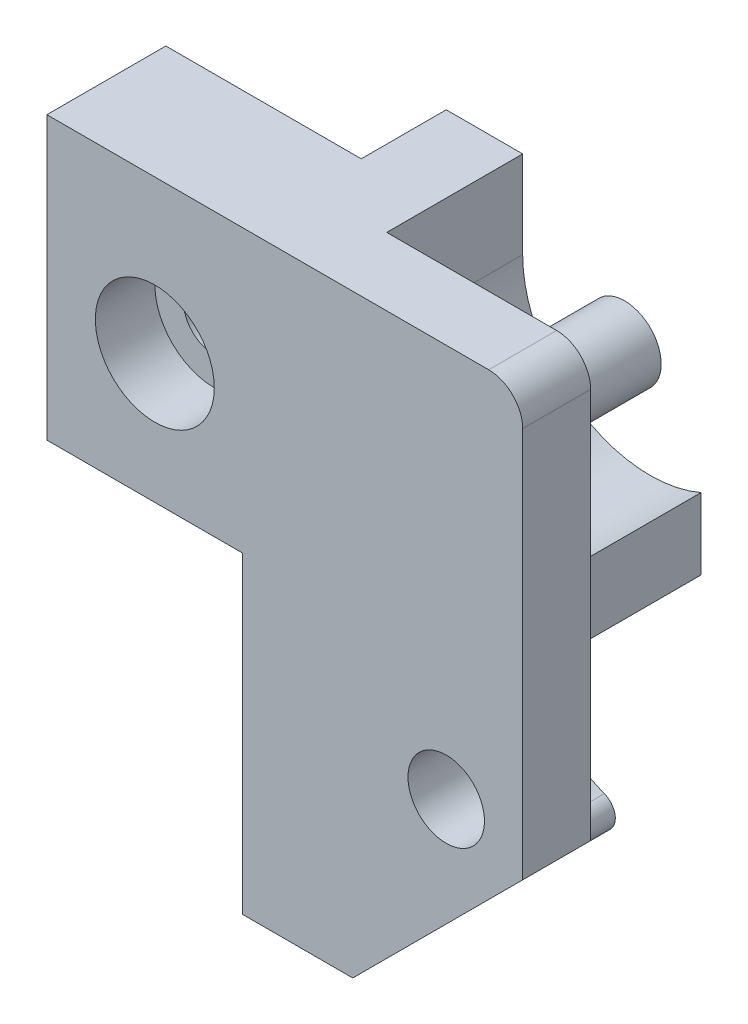
ISO-10303-21;
HEADER;
FILE_DESCRIPTION(('STEP AP214'),'2;1');
FILE_NAME('part.step','',(''),(''),'','','');
FILE_SCHEMA(('AUTOMOTIVE_DESIGN { 1 0 10303 214 1 1 1 1 }'));
ENDSEC;
DATA;
#1=APPLICATION_CONTEXT('core data for automotive mechanical design processes');
#2=APPLICATION_PROTOCOL_DEFINITION('international standard','automotive_design',2000,#1);
#3=PRODUCT_CONTEXT('',#1,'mechanical');
#4=PRODUCT('Part','Part','',(#3));
#5=PRODUCT_RELATED_PRODUCT_CATEGORY('part','',(#4));
#6=PRODUCT_DEFINITION_FORMATION('','',#4);
#7=PRODUCT_DEFINITION_CONTEXT('part definition',#1,'design');
#8=PRODUCT_DEFINITION('design','',#6,#7);
#9=PRODUCT_DEFINITION_SHAPE('','',#8);
#10=(LENGTH_UNIT() NAMED_UNIT(*) SI_UNIT(.MILLI.,.METRE.));
#11=(NAMED_UNIT(*) PLANE_ANGLE_UNIT() SI_UNIT($,.RADIAN.));
#12=(NAMED_UNIT(*) SI_UNIT($,.STERADIAN.) SOLID_ANGLE_UNIT());
#13=UNCERTAINTY_MEASURE_WITH_UNIT(LENGTH_MEASURE(1.E-05),#10,'distance_accuracy_value','');
#14=(GEOMETRIC_REPRESENTATION_CONTEXT(3) GLOBAL_UNCERTAINTY_ASSIGNED_CONTEXT((#13)) GLOBAL_UNIT_ASSIGNED_CONTEXT((#10,
#11,#12)) REPRESENTATION_CONTEXT('',''));
#15=CARTESIAN_POINT('',(0.,0.,0.));
#16=DIRECTION('',(0.,0.,1.));
#17=DIRECTION('',(1.,0.,0.));
#18=AXIS2_PLACEMENT_3D('',#15,#16,#17);
#19=CARTESIAN_POINT('',(23.5,29.8639610306789,-8.));
#20=DIRECTION('',(0.,0.,1.));
#21=DIRECTION('',(1.,0.,0.));
#22=AXIS2_PLACEMENT_3D('',#19,#20,#21);
#23=CYLINDRICAL_SURFACE('',#22,2.15);
#24=CARTESIAN_POINT('',(23.5,29.8639610306789,0.));
#25=DIRECTION('',(0.,0.,1.));
#26=DIRECTION('',(1.,0.,0.));
#27=AXIS2_PLACEMENT_3D('',#24,#25,#26);
#28=CIRCLE('',#27,2.15);
#29=CARTESIAN_POINT('',(25.65,29.8639610306789,0.));
#30=VERTEX_POINT('',#29);
#31=EDGE_CURVE('E45',#30,#30,#28,.F.);
#32=ORIENTED_EDGE('',*,*,#31,.T.);
#33=EDGE_LOOP('',(#32));
#34=FACE_BOUND('',#33,.T.);
#35=CARTESIAN_POINT('',(23.5,29.8639610306789,-6.5));
#36=DIRECTION('',(0.,0.,-1.));
#37=DIRECTION('',(-1.,0.,0.));
#38=AXIS2_PLACEMENT_3D('',#35,#36,#37);
#39=CIRCLE('',#38,2.15);
#40=CARTESIAN_POINT('',(21.35,29.8639610306789,-6.5));
#41=VERTEX_POINT('',#40);
#42=EDGE_CURVE('E391',#41,#41,#39,.T.);
#43=ORIENTED_EDGE('',*,*,#42,.F.);
#44=EDGE_LOOP('',(#43));
#45=FACE_BOUND('',#44,.T.);
#46=ADVANCED_FACE('F37',(#34,#45),#23,.T.);
#47=CARTESIAN_POINT('',(23.5,29.8639610306789,-8.));
#48=DIRECTION('',(0.,0.,-1.));
#49=DIRECTION('',(-1.,0.,0.));
#50=AXIS2_PLACEMENT_3D('',#47,#48,#49);
#51=PLANE('',#50);
#52=DIRECTION('',(1.,0.,0.));
#53=VECTOR('',#52,1.);
#54=CARTESIAN_POINT('',(0.,18.4139610306789,-8.));
#55=LINE('',#54,#53);
#56=CARTESIAN_POINT('',(11.5,18.4139610306789,-8.));
#57=VERTEX_POINT('',#56);
#58=CARTESIAN_POINT('',(19.7450033288963,18.4139610306789,-8.));
#59=VERTEX_POINT('',#58);
#60=EDGE_CURVE('E214',#57,#59,#55,.T.);
#61=ORIENTED_EDGE('',*,*,#60,.F.);
#62=DIRECTION('',(0.,1.,0.));
#63=VECTOR('',#62,1.);
#64=CARTESIAN_POINT('',(11.5,0.,-8.));
#65=LINE('',#64,#63);
#66=CARTESIAN_POINT('',(11.5,35.,-8.));
#67=VERTEX_POINT('',#66);
#68=EDGE_CURVE('E388',#57,#67,#65,.T.);
#69=ORIENTED_EDGE('',*,*,#68,.T.);
#70=DIRECTION('',(1.,0.,0.));
#71=VECTOR('',#70,1.);
#72=CARTESIAN_POINT('',(0.,35.,-8.));
#73=LINE('',#72,#71);
#74=CARTESIAN_POINT('',(16.,35.,-8.));
#75=VERTEX_POINT('',#74);
#76=EDGE_CURVE('E228',#67,#75,#73,.T.);
#77=ORIENTED_EDGE('',*,*,#76,.T.);
#78=DIRECTION('',(0.,1.,0.));
#79=VECTOR('',#78,1.);
#80=CARTESIAN_POINT('',(16.,0.,-8.));
#81=LINE('',#80,#79);
#82=CARTESIAN_POINT('',(16.,29.8639610306789,-8.));
#83=VERTEX_POINT('',#82);
#84=EDGE_CURVE('E220',#83,#75,#81,.T.);
#85=ORIENTED_EDGE('',*,*,#84,.F.);
#86=CARTESIAN_POINT('',(23.5,29.8639610306789,-8.));
#87=DIRECTION('',(0.,0.,-1.));
#88=DIRECTION('',(-1.,0.,0.));
#89=AXIS2_PLACEMENT_3D('',#86,#87,#88);
#90=CIRCLE('',#89,7.5);
#91=CARTESIAN_POINT('',(26.5,22.9900974882452,-8.));
#92=VERTEX_POINT('',#91);
#93=EDGE_CURVE('E224',#92,#83,#90,.T.);
#94=ORIENTED_EDGE('',*,*,#93,.F.);
#95=DIRECTION('',(0.,-1.,0.));
#96=VECTOR('',#95,1.);
#97=CARTESIAN_POINT('',(26.5,0.,-8.));
#98=LINE('',#97,#96);
#99=CARTESIAN_POINT('',(26.5,18.7923446805644,-8.));
#100=VERTEX_POINT('',#99);
#101=EDGE_CURVE('E235',#92,#100,#98,.T.);
#102=ORIENTED_EDGE('',*,*,#101,.T.);
#103=CARTESIAN_POINT('',(23.5,11.8639610306789,-8.));
#104=DIRECTION('',(0.,0.,-1.));
#105=DIRECTION('',(-1.,0.,0.));
#106=AXIS2_PLACEMENT_3D('',#103,#104,#105);
#107=CIRCLE('',#106,7.55);
#108=EDGE_CURVE('E238',#59,#100,#107,.T.);
#109=ORIENTED_EDGE('',*,*,#108,.F.);
#110=EDGE_LOOP('',(#61,#69,#77,#85,#94,#102,#109));
#111=FACE_BOUND('',#110,.T.);
#112=ADVANCED_FACE('F327',(#111),#51,.T.);
#113=CARTESIAN_POINT('',(0.,0.,4.));
#114=DIRECTION('',(1.,0.,0.));
#115=DIRECTION('',(0.,0.,-1.));
#116=AXIS2_PLACEMENT_3D('',#113,#114,#115);
#117=PLANE('',#116);
#118=DIRECTION('',(0.,1.,0.));
#119=VECTOR('',#118,1.);
#120=CARTESIAN_POINT('',(0.,0.,-3.));
#121=LINE('',#120,#119);
#122=CARTESIAN_POINT('',(0.,18.4139610306789,-3.));
#123=VERTEX_POINT('',#122);
#124=CARTESIAN_POINT('',(0.,35.,-3.));
#125=VERTEX_POINT('',#124);
#126=EDGE_CURVE('E172',#123,#125,#121,.T.);
#127=ORIENTED_EDGE('',*,*,#126,.F.);
#128=DIRECTION('',(0.,0.,-1.));
#129=VECTOR('',#128,1.);
#130=CARTESIAN_POINT('',(0.,18.4139610306789,4.));
#131=LINE('',#130,#129);
#132=CARTESIAN_POINT('',(0.,18.4139610306789,4.));
#133=VERTEX_POINT('',#132);
#134=EDGE_CURVE('E182',#133,#123,#131,.T.);
#135=ORIENTED_EDGE('',*,*,#134,.F.);
#136=DIRECTION('',(0.,-1.,0.));
#137=VECTOR('',#136,1.);
#138=CARTESIAN_POINT('',(0.,0.,4.));
#139=LINE('',#138,#137);
#140=CARTESIAN_POINT('',(0.,35.,4.));
#141=VERTEX_POINT('',#140);
#142=EDGE_CURVE('E274',#141,#133,#139,.T.);
#143=ORIENTED_EDGE('',*,*,#142,.F.);
#144=DIRECTION('',(0.,0.,-1.));
#145=VECTOR('',#144,1.);
#146=CARTESIAN_POINT('',(0.,35.,4.));
#147=LINE('',#146,#145);
#148=EDGE_CURVE('E185',#141,#125,#147,.T.);
#149=ORIENTED_EDGE('',*,*,#148,.T.);
#150=EDGE_LOOP('',(#127,#135,#143,#149));
#151=FACE_BOUND('',#150,.T.);
#152=ADVANCED_FACE('F39',(#151),#117,.F.);
#153=CARTESIAN_POINT('',(0.,35.,4.));
#154=DIRECTION('',(0.,-1.,0.));
#155=DIRECTION('',(0.,0.,-1.));
#156=AXIS2_PLACEMENT_3D('',#153,#154,#155);
#157=PLANE('',#156);
#158=DIRECTION('',(0.,0.,-1.));
#159=VECTOR('',#158,1.);
#160=CARTESIAN_POINT('',(11.5,35.,-3.));
#161=LINE('',#160,#159);
#162=CARTESIAN_POINT('',(11.5,35.,-3.));
#163=VERTEX_POINT('',#162);
#164=EDGE_CURVE('E381',#163,#67,#161,.T.);
#165=ORIENTED_EDGE('',*,*,#164,.F.);
#166=DIRECTION('',(1.,0.,0.));
#167=VECTOR('',#166,1.);
#168=CARTESIAN_POINT('',(0.,35.,-3.));
#169=LINE('',#168,#167);
#170=EDGE_CURVE('E186',#125,#163,#169,.T.);
#171=ORIENTED_EDGE('',*,*,#170,.F.);
#172=ORIENTED_EDGE('',*,*,#148,.F.);
#173=DIRECTION('',(-1.,0.,0.));
#174=VECTOR('',#173,1.);
#175=CARTESIAN_POINT('',(0.,35.,4.));
#176=LINE('',#175,#174);
#177=CARTESIAN_POINT('',(26.,35.,4.));
#178=VERTEX_POINT('',#177);
#179=EDGE_CURVE('E285',#178,#141,#176,.T.);
#180=ORIENTED_EDGE('',*,*,#179,.F.);
#181=DIRECTION('',(0.,0.,-1.));
#182=VECTOR('',#181,1.);
#183=CARTESIAN_POINT('',(26.,35.,4.));
#184=LINE('',#183,#182);
#185=CARTESIAN_POINT('',(26.,35.,0.));
#186=VERTEX_POINT('',#185);
#187=EDGE_CURVE('E295',#178,#186,#184,.T.);
#188=ORIENTED_EDGE('',*,*,#187,.T.);
#189=DIRECTION('',(-1.,0.,0.));
#190=VECTOR('',#189,1.);
#191=CARTESIAN_POINT('',(0.,35.,0.));
#192=LINE('',#191,#190);
#193=CARTESIAN_POINT('',(16.,35.,0.));
#194=VERTEX_POINT('',#193);
#195=EDGE_CURVE('E277',#186,#194,#192,.T.);
#196=ORIENTED_EDGE('',*,*,#195,.T.);
#197=DIRECTION('',(0.,0.,1.));
#198=VECTOR('',#197,1.);
#199=CARTESIAN_POINT('',(16.,35.,-51.9004555785017));
#200=LINE('',#199,#198);
#201=EDGE_CURVE('E231',#75,#194,#200,.T.);
#202=ORIENTED_EDGE('',*,*,#201,.F.);
#203=ORIENTED_EDGE('',*,*,#76,.F.);
#204=EDGE_LOOP('',(#165,#171,#172,#180,#188,#196,#202,#203));
#205=FACE_BOUND('',#204,.T.);
#206=ADVANCED_FACE('F379',(#205),#157,.F.);
#207=CARTESIAN_POINT('',(0.,18.4139610306789,-51.9004555785017));
#208=DIRECTION('',(0.,-1.,0.));
#209=DIRECTION('',(1.,0.,0.));
#210=AXIS2_PLACEMENT_3D('',#207,#208,#209);
#211=PLANE('',#210);
#212=DIRECTION('',(-1.,0.,0.));
#213=VECTOR('',#212,1.);
#214=CARTESIAN_POINT('',(0.,18.4139610306789,-3.));
#215=LINE('',#214,#213);
#216=CARTESIAN_POINT('',(11.5,18.4139610306789,-3.));
#217=VERTEX_POINT('',#216);
#218=EDGE_CURVE('E168',#217,#123,#215,.T.);
#219=ORIENTED_EDGE('',*,*,#218,.F.);
#220=DIRECTION('',(0.,0.,-1.));
#221=VECTOR('',#220,1.);
#222=CARTESIAN_POINT('',(11.5,18.4139610306789,-3.));
#223=LINE('',#222,#221);
#224=EDGE_CURVE('E385',#217,#57,#223,.T.);
#225=ORIENTED_EDGE('',*,*,#224,.T.);
#226=ORIENTED_EDGE('',*,*,#60,.T.);
#227=DIRECTION('',(0.,0.,1.));
#228=VECTOR('',#227,1.);
#229=CARTESIAN_POINT('',(19.7450033288963,18.4139610306789,-51.9004555785017));
#230=LINE('',#229,#228);
#231=CARTESIAN_POINT('',(19.7450033288963,18.4139610306789,0.));
#232=VERTEX_POINT('',#231);
#233=EDGE_CURVE('E242',#59,#232,#230,.T.);
#234=ORIENTED_EDGE('',*,*,#233,.T.);
#235=DIRECTION('',(1.,0.,0.));
#236=VECTOR('',#235,1.);
#237=CARTESIAN_POINT('',(0.,18.4139610306789,0.));
#238=LINE('',#237,#236);
#239=CARTESIAN_POINT('',(11.5,18.4139610306789,0.));
#240=VERTEX_POINT('',#239);
#241=EDGE_CURVE('E208',#240,#232,#238,.T.);
#242=ORIENTED_EDGE('',*,*,#241,.F.);
#243=DIRECTION('',(0.,0.,-1.));
#244=VECTOR('',#243,1.);
#245=CARTESIAN_POINT('',(11.5,18.4139610306789,4.));
#246=LINE('',#245,#244);
#247=CARTESIAN_POINT('',(11.5,18.4139610306789,4.));
#248=VERTEX_POINT('',#247);
#249=EDGE_CURVE('E191',#248,#240,#246,.T.);
#250=ORIENTED_EDGE('',*,*,#249,.F.);
#251=DIRECTION('',(1.,0.,0.));
#252=VECTOR('',#251,1.);
#253=CARTESIAN_POINT('',(0.,18.4139610306789,4.));
#254=LINE('',#253,#252);
#255=EDGE_CURVE('E190',#133,#248,#254,.T.);
#256=ORIENTED_EDGE('',*,*,#255,.F.);
#257=ORIENTED_EDGE('',*,*,#134,.T.);
#258=EDGE_LOOP('',(#219,#225,#226,#234,#242,#250,#256,#257));
#259=FACE_BOUND('',#258,.T.);
#260=ADVANCED_FACE('F188',(#259),#211,.T.);
#261=CARTESIAN_POINT('',(6.35,26.,4.));
#262=DIRECTION('',(0.,0.,1.));
#263=DIRECTION('',(1.,0.,0.));
#264=AXIS2_PLACEMENT_3D('',#261,#262,#263);
#265=CYLINDRICAL_SURFACE('',#264,1.8288);
#266=CARTESIAN_POINT('',(6.35,26.,0.4948));
#267=DIRECTION('',(0.,0.,1.));
#268=DIRECTION('',(1.,0.,0.));
#269=AXIS2_PLACEMENT_3D('',#266,#267,#268);
#270=CIRCLE('',#269,1.8288);
#271=CARTESIAN_POINT('',(8.1788,26.,0.4948));
#272=VERTEX_POINT('',#271);
#273=EDGE_CURVE('E398',#272,#272,#270,.T.);
#274=ORIENTED_EDGE('',*,*,#273,.T.);
#275=EDGE_LOOP('',(#274));
#276=FACE_BOUND('',#275,.T.);
#277=CARTESIAN_POINT('',(6.35,26.,-3.));
#278=DIRECTION('',(0.,0.,-1.));
#279=DIRECTION('',(-1.,0.,0.));
#280=AXIS2_PLACEMENT_3D('',#277,#278,#279);
#281=CIRCLE('',#280,1.8288);
#282=CARTESIAN_POINT('',(4.5212,26.,-3.));
#283=VERTEX_POINT('',#282);
#284=EDGE_CURVE('E382',#283,#283,#281,.F.);
#285=ORIENTED_EDGE('',*,*,#284,.F.);
#286=EDGE_LOOP('',(#285));
#287=FACE_BOUND('',#286,.T.);
#288=ADVANCED_FACE('F313',(#276,#287),#265,.F.);
#289=CARTESIAN_POINT('',(26.,33.,0.));
#290=DIRECTION('',(0.,0.,1.));
#291=DIRECTION('',(1.,0.,0.));
#292=AXIS2_PLACEMENT_3D('',#289,#290,#291);
#293=PLANE('',#292);
#294=CARTESIAN_POINT('',(23.5,29.8639610306789,0.));
#295=DIRECTION('',(0.,0.,-1.));
#296=DIRECTION('',(-1.,0.,0.));
#297=AXIS2_PLACEMENT_3D('',#294,#295,#296);
#298=CIRCLE('',#297,7.5);
#299=CARTESIAN_POINT('',(26.5,22.9900974882452,0.));
#300=VERTEX_POINT('',#299);
#301=CARTESIAN_POINT('',(16.,29.8639610306789,0.));
#302=VERTEX_POINT('',#301);
#303=EDGE_CURVE('E205',#300,#302,#298,.T.);
#304=ORIENTED_EDGE('',*,*,#303,.T.);
#305=DIRECTION('',(0.,1.,0.));
#306=VECTOR('',#305,1.);
#307=CARTESIAN_POINT('',(16.,0.,0.));
#308=LINE('',#307,#306);
#309=EDGE_CURVE('E201',#302,#194,#308,.T.);
#310=ORIENTED_EDGE('',*,*,#309,.T.);
#311=ORIENTED_EDGE('',*,*,#195,.F.);
#312=CARTESIAN_POINT('',(26.,33.,0.));
#313=DIRECTION('',(0.,0.,1.));
#314=DIRECTION('',(1.,0.,0.));
#315=AXIS2_PLACEMENT_3D('',#312,#313,#314);
#316=CIRCLE('',#315,2.);
#317=CARTESIAN_POINT('',(28.,33.,0.));
#318=VERTEX_POINT('',#317);
#319=EDGE_CURVE('E290',#318,#186,#316,.T.);
#320=ORIENTED_EDGE('',*,*,#319,.F.);
#321=DIRECTION('',(0.,1.,0.));
#322=VECTOR('',#321,1.);
#323=CARTESIAN_POINT('',(28.,10.,0.));
#324=LINE('',#323,#322);
#325=CARTESIAN_POINT('',(28.,10.,0.));
#326=VERTEX_POINT('',#325);
#327=EDGE_CURVE('E288',#326,#318,#324,.T.);
#328=ORIENTED_EDGE('',*,*,#327,.F.);
#329=DIRECTION('',(0.707106781186547,0.707106781186548,0.));
#330=VECTOR('',#329,1.);
#331=CARTESIAN_POINT('',(18.,0.,0.));
#332=LINE('',#331,#330);
#333=CARTESIAN_POINT('',(21.1582561300546,3.15825613005459,0.));
#334=VERTEX_POINT('',#333);
#335=EDGE_CURVE('E271',#334,#326,#332,.T.);
#336=ORIENTED_EDGE('',*,*,#335,.F.);
#337=CARTESIAN_POINT('',(20.451149348868,3.86536291124113,0.));
#338=DIRECTION('',(0.,0.,-1.));
#339=DIRECTION('',(-1.,0.,0.));
#340=AXIS2_PLACEMENT_3D('',#337,#338,#339);
#341=CIRCLE('',#340,0.999999999999998);
#342=CARTESIAN_POINT('',(20.807324797528,4.79978200874067,0.));
#343=VERTEX_POINT('',#342);
#344=EDGE_CURVE('E204',#334,#343,#341,.F.);
#345=ORIENTED_EDGE('',*,*,#344,.T.);
#346=CARTESIAN_POINT('',(23.5,11.8639610306789,0.));
#347=DIRECTION('',(0.,0.,-1.));
#348=DIRECTION('',(-1.,0.,0.));
#349=AXIS2_PLACEMENT_3D('',#346,#347,#348);
#350=CIRCLE('',#349,7.55996858459081);
#351=CARTESIAN_POINT('',(19.725,5.31396103067893,0.));
#352=VERTEX_POINT('',#351);
#353=EDGE_CURVE('E209',#352,#343,#350,.F.);
#354=ORIENTED_EDGE('',*,*,#353,.F.);
#355=DIRECTION('',(1.,0.,0.));
#356=VECTOR('',#355,1.);
#357=CARTESIAN_POINT('',(0.,5.31396103067893,0.));
#358=LINE('',#357,#356);
#359=CARTESIAN_POINT('',(11.5,5.31396103067893,0.));
#360=VERTEX_POINT('',#359);
#361=EDGE_CURVE('E60',#360,#352,#358,.T.);
#362=ORIENTED_EDGE('',*,*,#361,.F.);
#363=DIRECTION('',(0.,-1.,0.));
#364=VECTOR('',#363,1.);
#365=CARTESIAN_POINT('',(11.5,0.,0.));
#366=LINE('',#365,#364);
#367=EDGE_CURVE('E401',#240,#360,#366,.T.);
#368=ORIENTED_EDGE('',*,*,#367,.F.);
#369=ORIENTED_EDGE('',*,*,#241,.T.);
#370=CARTESIAN_POINT('',(23.5,11.8639610306789,0.));
#371=DIRECTION('',(0.,0.,-1.));
#372=DIRECTION('',(-1.,0.,0.));
#373=AXIS2_PLACEMENT_3D('',#370,#371,#372);
#374=CIRCLE('',#373,7.55);
#375=CARTESIAN_POINT('',(26.5,18.7923446805644,0.));
#376=VERTEX_POINT('',#375);
#377=EDGE_CURVE('E217',#232,#376,#374,.T.);
#378=ORIENTED_EDGE('',*,*,#377,.T.);
#379=DIRECTION('',(0.,-1.,0.));
#380=VECTOR('',#379,1.);
#381=CARTESIAN_POINT('',(26.5,0.,0.));
#382=LINE('',#381,#380);
#383=EDGE_CURVE('E221',#300,#376,#382,.T.);
#384=ORIENTED_EDGE('',*,*,#383,.F.);
#385=EDGE_LOOP('',(#304,#310,#311,#320,#328,#336,#345,#354,#362,#368,#369,#378,#384));
#386=FACE_BOUND('',#385,.T.);
#387=CARTESIAN_POINT('',(23.5,11.8639610306789,0.));
#388=DIRECTION('',(0.,0.,-1.));
#389=DIRECTION('',(-1.,0.,0.));
#390=AXIS2_PLACEMENT_3D('',#387,#388,#389);
#391=CIRCLE('',#390,2.25);
#392=CARTESIAN_POINT('',(21.25,11.8639610306789,0.));
#393=VERTEX_POINT('',#392);
#394=EDGE_CURVE('E267',#393,#393,#391,.T.);
#395=ORIENTED_EDGE('',*,*,#394,.F.);
#396=EDGE_LOOP('',(#395));
#397=FACE_BOUND('',#396,.T.);
#398=ORIENTED_EDGE('',*,*,#31,.F.);
#399=EDGE_LOOP('',(#398));
#400=FACE_BOUND('',#399,.T.);
#401=ADVANCED_FACE('F310',(#386,#397,#400),#293,.F.);
#402=CARTESIAN_POINT('',(0.,0.,4.));
#403=DIRECTION('',(0.,1.,0.));
#404=DIRECTION('',(0.,0.,1.));
#405=AXIS2_PLACEMENT_3D('',#402,#403,#404);
#406=PLANE('',#405);
#407=DIRECTION('',(1.,0.,0.));
#408=VECTOR('',#407,1.);
#409=CARTESIAN_POINT('',(0.,0.,4.));
#410=LINE('',#409,#408);
#411=CARTESIAN_POINT('',(11.5,0.,4.));
#412=VERTEX_POINT('',#411);
#413=CARTESIAN_POINT('',(18.,0.,4.));
#414=VERTEX_POINT('',#413);
#415=EDGE_CURVE('E276',#412,#414,#410,.T.);
#416=ORIENTED_EDGE('',*,*,#415,.F.);
#417=DIRECTION('',(0.,0.,-1.));
#418=VECTOR('',#417,1.);
#419=CARTESIAN_POINT('',(11.5,0.,4.));
#420=LINE('',#419,#418);
#421=CARTESIAN_POINT('',(11.5,0.,-8.));
#422=VERTEX_POINT('',#421);
#423=EDGE_CURVE('E195',#412,#422,#420,.T.);
#424=ORIENTED_EDGE('',*,*,#423,.T.);
#425=DIRECTION('',(-1.,0.,0.));
#426=VECTOR('',#425,1.);
#427=CARTESIAN_POINT('',(0.,0.,-8.));
#428=LINE('',#427,#426);
#429=CARTESIAN_POINT('',(18.,0.,-8.));
#430=VERTEX_POINT('',#429);
#431=EDGE_CURVE('E255',#430,#422,#428,.T.);
#432=ORIENTED_EDGE('',*,*,#431,.F.);
#433=DIRECTION('',(0.,0.,-1.));
#434=VECTOR('',#433,1.);
#435=CARTESIAN_POINT('',(18.,0.,4.));
#436=LINE('',#435,#434);
#437=EDGE_CURVE('E304',#414,#430,#436,.T.);
#438=ORIENTED_EDGE('',*,*,#437,.F.);
#439=EDGE_LOOP('',(#416,#424,#432,#438));
#440=FACE_BOUND('',#439,.T.);
#441=ADVANCED_FACE('F312',(#440),#406,.F.);
#442=CARTESIAN_POINT('',(18.,0.,4.));
#443=DIRECTION('',(-0.707106781186548,0.707106781186547,0.));
#444=DIRECTION('',(-0.707106781186547,-0.707106781186548,0.));
#445=AXIS2_PLACEMENT_3D('',#442,#443,#444);
#446=PLANE('',#445);
#447=ORIENTED_EDGE('',*,*,#437,.T.);
#448=DIRECTION('',(-0.707106781186548,-0.707106781186548,0.));
#449=VECTOR('',#448,1.);
#450=CARTESIAN_POINT('',(9.,-9.,-8.));
#451=LINE('',#450,#449);
#452=CARTESIAN_POINT('',(21.1582561300546,3.15825613005459,-8.));
#453=VERTEX_POINT('',#452);
#454=EDGE_CURVE('E247',#453,#430,#451,.T.);
#455=ORIENTED_EDGE('',*,*,#454,.F.);
#456=DIRECTION('',(0.,0.,1.));
#457=VECTOR('',#456,1.);
#458=CARTESIAN_POINT('',(21.1582561300546,3.15825613005459,-51.9004555785017));
#459=LINE('',#458,#457);
#460=EDGE_CURVE('E252',#453,#334,#459,.T.);
#461=ORIENTED_EDGE('',*,*,#460,.T.);
#462=ORIENTED_EDGE('',*,*,#335,.T.);
#463=DIRECTION('',(0.,0.,-1.));
#464=VECTOR('',#463,1.);
#465=CARTESIAN_POINT('',(28.,10.,4.));
#466=LINE('',#465,#464);
#467=CARTESIAN_POINT('',(28.,10.,4.));
#468=VERTEX_POINT('',#467);
#469=EDGE_CURVE('E301',#468,#326,#466,.T.);
#470=ORIENTED_EDGE('',*,*,#469,.F.);
#471=DIRECTION('',(0.707106781186547,0.707106781186548,0.));
#472=VECTOR('',#471,1.);
#473=CARTESIAN_POINT('',(18.,0.,4.));
#474=LINE('',#473,#472);
#475=EDGE_CURVE('E279',#414,#468,#474,.T.);
#476=ORIENTED_EDGE('',*,*,#475,.F.);
#477=EDGE_LOOP('',(#447,#455,#461,#462,#470,#476));
#478=FACE_BOUND('',#477,.T.);
#479=ADVANCED_FACE('F319',(#478),#446,.F.);
#480=CARTESIAN_POINT('',(28.,10.,4.));
#481=DIRECTION('',(-1.,0.,0.));
#482=DIRECTION('',(0.,-1.,0.));
#483=AXIS2_PLACEMENT_3D('',#480,#481,#482);
#484=PLANE('',#483);
#485=ORIENTED_EDGE('',*,*,#327,.T.);
#486=DIRECTION('',(0.,0.,-1.));
#487=VECTOR('',#486,1.);
#488=CARTESIAN_POINT('',(28.,33.,4.));
#489=LINE('',#488,#487);
#490=CARTESIAN_POINT('',(28.,33.,4.));
#491=VERTEX_POINT('',#490);
#492=EDGE_CURVE('E298',#491,#318,#489,.T.);
#493=ORIENTED_EDGE('',*,*,#492,.F.);
#494=DIRECTION('',(0.,1.,0.));
#495=VECTOR('',#494,1.);
#496=CARTESIAN_POINT('',(28.,10.,4.));
#497=LINE('',#496,#495);
#498=EDGE_CURVE('E281',#468,#491,#497,.T.);
#499=ORIENTED_EDGE('',*,*,#498,.F.);
#500=ORIENTED_EDGE('',*,*,#469,.T.);
#501=EDGE_LOOP('',(#485,#493,#499,#500));
#502=FACE_BOUND('',#501,.T.);
#503=ADVANCED_FACE('F347',(#502),#484,.F.);
#504=CARTESIAN_POINT('',(26.,33.,4.));
#505=DIRECTION('',(0.,0.,-1.));
#506=DIRECTION('',(-1.,0.,0.));
#507=AXIS2_PLACEMENT_3D('',#504,#505,#506);
#508=CYLINDRICAL_SURFACE('',#507,2.);
#509=ORIENTED_EDGE('',*,*,#319,.T.);
#510=ORIENTED_EDGE('',*,*,#187,.F.);
#511=CARTESIAN_POINT('',(26.,33.,4.));
#512=DIRECTION('',(0.,0.,1.));
#513=DIRECTION('',(1.,0.,0.));
#514=AXIS2_PLACEMENT_3D('',#511,#512,#513);
#515=CIRCLE('',#514,2.);
#516=EDGE_CURVE('E283',#491,#178,#515,.T.);
#517=ORIENTED_EDGE('',*,*,#516,.F.);
#518=ORIENTED_EDGE('',*,*,#492,.T.);
#519=EDGE_LOOP('',(#509,#510,#517,#518));
#520=FACE_BOUND('',#519,.T.);
#521=ADVANCED_FACE('F342',(#520),#508,.T.);
#522=CARTESIAN_POINT('',(26.,33.,4.));
#523=DIRECTION('',(0.,0.,1.));
#524=DIRECTION('',(1.,0.,0.));
#525=AXIS2_PLACEMENT_3D('',#522,#523,#524);
#526=PLANE('',#525);
#527=CARTESIAN_POINT('',(6.35,26.,4.));
#528=DIRECTION('',(0.,0.,1.));
#529=DIRECTION('',(1.,0.,0.));
#530=AXIS2_PLACEMENT_3D('',#527,#528,#529);
#531=CIRCLE('',#530,3.5);
#532=CARTESIAN_POINT('',(9.85,26.,4.));
#533=VERTEX_POINT('',#532);
#534=EDGE_CURVE('E353',#533,#533,#531,.T.);
#535=ORIENTED_EDGE('',*,*,#534,.F.);
#536=EDGE_LOOP('',(#535));
#537=FACE_BOUND('',#536,.T.);
#538=DIRECTION('',(0.,-1.,0.));
#539=VECTOR('',#538,1.);
#540=CARTESIAN_POINT('',(11.5,0.,4.));
#541=LINE('',#540,#539);
#542=EDGE_CURVE('E192',#248,#412,#541,.T.);
#543=ORIENTED_EDGE('',*,*,#542,.T.);
#544=ORIENTED_EDGE('',*,*,#415,.T.);
#545=ORIENTED_EDGE('',*,*,#475,.T.);
#546=ORIENTED_EDGE('',*,*,#498,.T.);
#547=ORIENTED_EDGE('',*,*,#516,.T.);
#548=ORIENTED_EDGE('',*,*,#179,.T.);
#549=ORIENTED_EDGE('',*,*,#142,.T.);
#550=ORIENTED_EDGE('',*,*,#255,.T.);
#551=EDGE_LOOP('',(#543,#544,#545,#546,#547,#548,#549,#550));
#552=FACE_BOUND('',#551,.T.);
#553=CARTESIAN_POINT('',(23.5,11.8639610306789,4.));
#554=DIRECTION('',(0.,0.,-1.));
#555=DIRECTION('',(-1.,0.,0.));
#556=AXIS2_PLACEMENT_3D('',#553,#554,#555);
#557=CIRCLE('',#556,2.25);
#558=CARTESIAN_POINT('',(21.25,11.8639610306789,4.));
#559=VERTEX_POINT('',#558);
#560=EDGE_CURVE('E268',#559,#559,#557,.T.);
#561=ORIENTED_EDGE('',*,*,#560,.T.);
#562=EDGE_LOOP('',(#561));
#563=FACE_BOUND('',#562,.T.);
#564=ADVANCED_FACE('F339',(#537,#552,#563),#526,.T.);
#565=CARTESIAN_POINT('',(23.5,11.8639610306789,4.));
#566=DIRECTION('',(0.,0.,-1.));
#567=DIRECTION('',(-1.,0.,0.));
#568=AXIS2_PLACEMENT_3D('',#565,#566,#567);
#569=CYLINDRICAL_SURFACE('',#568,2.25);
#570=ORIENTED_EDGE('',*,*,#560,.F.);
#571=EDGE_LOOP('',(#570));
#572=FACE_BOUND('',#571,.T.);
#573=ORIENTED_EDGE('',*,*,#394,.T.);
#574=EDGE_LOOP('',(#573));
#575=FACE_BOUND('',#574,.T.);
#576=ADVANCED_FACE('F337',(#572,#575),#569,.F.);
#577=DIRECTION('',(0.,-1.,0.));
#578=VECTOR('',#577,1.);
#579=CARTESIAN_POINT('',(11.5,0.,-8.));
#580=LINE('',#579,#578);
#581=CARTESIAN_POINT('',(11.5,5.31396103067893,-8.));
#582=VERTEX_POINT('',#581);
#583=EDGE_CURVE('E404',#582,#422,#580,.T.);
#584=ORIENTED_EDGE('',*,*,#583,.F.);
#585=DIRECTION('',(1.,0.,0.));
#586=VECTOR('',#585,1.);
#587=CARTESIAN_POINT('',(0.,5.31396103067893,-8.));
#588=LINE('',#587,#586);
#589=CARTESIAN_POINT('',(19.725,5.31396103067893,-8.));
#590=VERTEX_POINT('',#589);
#591=EDGE_CURVE('E237',#582,#590,#588,.T.);
#592=ORIENTED_EDGE('',*,*,#591,.T.);
#593=CARTESIAN_POINT('',(23.5,11.8639610306789,-8.));
#594=DIRECTION('',(0.,0.,-1.));
#595=DIRECTION('',(-1.,0.,0.));
#596=AXIS2_PLACEMENT_3D('',#593,#594,#595);
#597=CIRCLE('',#596,7.55996858459081);
#598=CARTESIAN_POINT('',(20.807324797528,4.79978200874067,-8.));
#599=VERTEX_POINT('',#598);
#600=EDGE_CURVE('E245',#590,#599,#597,.F.);
#601=ORIENTED_EDGE('',*,*,#600,.T.);
#602=CARTESIAN_POINT('',(20.451149348868,3.86536291124113,-8.));
#603=DIRECTION('',(0.,0.,-1.));
#604=DIRECTION('',(-1.,0.,0.));
#605=AXIS2_PLACEMENT_3D('',#602,#603,#604);
#606=CIRCLE('',#605,0.999999999999998);
#607=EDGE_CURVE('E248',#453,#599,#606,.F.);
#608=ORIENTED_EDGE('',*,*,#607,.F.);
#609=ORIENTED_EDGE('',*,*,#454,.T.);
#610=ORIENTED_EDGE('',*,*,#431,.T.);
#611=EDGE_LOOP('',(#584,#592,#601,#608,#609,#610));
#612=FACE_BOUND('',#611,.T.);
#613=ADVANCED_FACE('F334',(#612),#51,.T.);
#614=CARTESIAN_POINT('',(16.,0.,-51.9004555785017));
#615=DIRECTION('',(1.,0.,0.));
#616=DIRECTION('',(0.,0.,-1.));
#617=AXIS2_PLACEMENT_3D('',#614,#615,#616);
#618=PLANE('',#617);
#619=DIRECTION('',(0.,0.,1.));
#620=VECTOR('',#619,1.);
#621=CARTESIAN_POINT('',(16.,29.8639610306789,-51.9004555785017));
#622=LINE('',#621,#620);
#623=EDGE_CURVE('E234',#83,#302,#622,.T.);
#624=ORIENTED_EDGE('',*,*,#623,.F.);
#625=ORIENTED_EDGE('',*,*,#84,.T.);
#626=ORIENTED_EDGE('',*,*,#201,.T.);
#627=ORIENTED_EDGE('',*,*,#309,.F.);
#628=EDGE_LOOP('',(#624,#625,#626,#627));
#629=FACE_BOUND('',#628,.T.);
#630=ADVANCED_FACE('F420',(#629),#618,.T.);
#631=CARTESIAN_POINT('',(20.451149348868,3.86536291124113,-51.9004555785017));
#632=DIRECTION('',(0.,0.,1.));
#633=DIRECTION('',(1.,0.,0.));
#634=AXIS2_PLACEMENT_3D('',#631,#632,#633);
#635=CYLINDRICAL_SURFACE('',#634,0.999999999999998);
#636=ORIENTED_EDGE('',*,*,#460,.F.);
#637=ORIENTED_EDGE('',*,*,#607,.T.);
#638=DIRECTION('',(0.,0.,1.));
#639=VECTOR('',#638,1.);
#640=CARTESIAN_POINT('',(20.807324797528,4.79978200874067,-51.9004555785017));
#641=LINE('',#640,#639);
#642=EDGE_CURVE('E251',#599,#343,#641,.T.);
#643=ORIENTED_EDGE('',*,*,#642,.T.);
#644=ORIENTED_EDGE('',*,*,#344,.F.);
#645=EDGE_LOOP('',(#636,#637,#643,#644));
#646=FACE_BOUND('',#645,.T.);
#647=ADVANCED_FACE('F414',(#646),#635,.T.);
#648=CARTESIAN_POINT('',(23.5,11.8639610306789,-51.9004555785017));
#649=DIRECTION('',(0.,0.,1.));
#650=DIRECTION('',(1.,0.,0.));
#651=AXIS2_PLACEMENT_3D('',#648,#649,#650);
#652=CYLINDRICAL_SURFACE('',#651,7.55996858459081);
#653=ORIENTED_EDGE('',*,*,#600,.F.);
#654=DIRECTION('',(0.,0.,1.));
#655=VECTOR('',#654,1.);
#656=CARTESIAN_POINT('',(19.725,5.31396103067893,-51.9004555785017));
#657=LINE('',#656,#655);
#658=EDGE_CURVE('E212',#590,#352,#657,.T.);
#659=ORIENTED_EDGE('',*,*,#658,.T.);
#660=ORIENTED_EDGE('',*,*,#353,.T.);
#661=ORIENTED_EDGE('',*,*,#642,.F.);
#662=EDGE_LOOP('',(#653,#659,#660,#661));
#663=FACE_BOUND('',#662,.T.);
#664=ADVANCED_FACE('F474',(#663),#652,.F.);
#665=CARTESIAN_POINT('',(0.,5.31396103067893,-51.9004555785017));
#666=DIRECTION('',(0.,-1.,0.));
#667=DIRECTION('',(1.,0.,0.));
#668=AXIS2_PLACEMENT_3D('',#665,#666,#667);
#669=PLANE('',#668);
#670=ORIENTED_EDGE('',*,*,#591,.F.);
#671=DIRECTION('',(0.,0.,-1.));
#672=VECTOR('',#671,1.);
#673=CARTESIAN_POINT('',(11.5,5.31396103067893,4.));
#674=LINE('',#673,#672);
#675=EDGE_CURVE('E11',#360,#582,#674,.T.);
#676=ORIENTED_EDGE('',*,*,#675,.F.);
#677=ORIENTED_EDGE('',*,*,#361,.T.);
#678=ORIENTED_EDGE('',*,*,#658,.F.);
#679=EDGE_LOOP('',(#670,#676,#677,#678));
#680=FACE_BOUND('',#679,.T.);
#681=ADVANCED_FACE('F469',(#680),#669,.F.);
#682=CARTESIAN_POINT('',(23.5,11.8639610306789,-51.9004555785017));
#683=DIRECTION('',(0.,0.,1.));
#684=DIRECTION('',(1.,0.,0.));
#685=AXIS2_PLACEMENT_3D('',#682,#683,#684);
#686=CYLINDRICAL_SURFACE('',#685,7.55);
#687=ORIENTED_EDGE('',*,*,#233,.F.);
#688=ORIENTED_EDGE('',*,*,#108,.T.);
#689=DIRECTION('',(0.,0.,1.));
#690=VECTOR('',#689,1.);
#691=CARTESIAN_POINT('',(26.5,18.7923446805644,-51.9004555785017));
#692=LINE('',#691,#690);
#693=EDGE_CURVE('E241',#100,#376,#692,.T.);
#694=ORIENTED_EDGE('',*,*,#693,.T.);
#695=ORIENTED_EDGE('',*,*,#377,.F.);
#696=EDGE_LOOP('',(#687,#688,#694,#695));
#697=FACE_BOUND('',#696,.T.);
#698=ADVANCED_FACE('F435',(#697),#686,.F.);
#699=CARTESIAN_POINT('',(26.5,0.,-51.9004555785017));
#700=DIRECTION('',(-1.,0.,0.));
#701=DIRECTION('',(0.,-1.,0.));
#702=AXIS2_PLACEMENT_3D('',#699,#700,#701);
#703=PLANE('',#702);
#704=ORIENTED_EDGE('',*,*,#101,.F.);
#705=DIRECTION('',(0.,0.,1.));
#706=VECTOR('',#705,1.);
#707=CARTESIAN_POINT('',(26.5,22.9900974882452,-51.9004555785017));
#708=LINE('',#707,#706);
#709=EDGE_CURVE('E225',#92,#300,#708,.T.);
#710=ORIENTED_EDGE('',*,*,#709,.T.);
#711=ORIENTED_EDGE('',*,*,#383,.T.);
#712=ORIENTED_EDGE('',*,*,#693,.F.);
#713=EDGE_LOOP('',(#704,#710,#711,#712));
#714=FACE_BOUND('',#713,.T.);
#715=ADVANCED_FACE('F430',(#714),#703,.F.);
#716=CARTESIAN_POINT('',(23.5,29.8639610306789,-51.9004555785017));
#717=DIRECTION('',(0.,0.,1.));
#718=DIRECTION('',(1.,0.,0.));
#719=AXIS2_PLACEMENT_3D('',#716,#717,#718);
#720=CYLINDRICAL_SURFACE('',#719,7.5);
#721=ORIENTED_EDGE('',*,*,#709,.F.);
#722=ORIENTED_EDGE('',*,*,#93,.T.);
#723=ORIENTED_EDGE('',*,*,#623,.T.);
#724=ORIENTED_EDGE('',*,*,#303,.F.);
#725=EDGE_LOOP('',(#721,#722,#723,#724));
#726=FACE_BOUND('',#725,.T.);
#727=ADVANCED_FACE('F424',(#726),#720,.F.);
#728=CARTESIAN_POINT('',(11.5,0.,4.));
#729=DIRECTION('',(1.,0.,0.));
#730=DIRECTION('',(0.,0.,-1.));
#731=AXIS2_PLACEMENT_3D('',#728,#729,#730);
#732=PLANE('',#731);
#733=ORIENTED_EDGE('',*,*,#367,.T.);
#734=ORIENTED_EDGE('',*,*,#675,.T.);
#735=ORIENTED_EDGE('',*,*,#583,.T.);
#736=ORIENTED_EDGE('',*,*,#423,.F.);
#737=ORIENTED_EDGE('',*,*,#542,.F.);
#738=ORIENTED_EDGE('',*,*,#249,.T.);
#739=EDGE_LOOP('',(#733,#734,#735,#736,#737,#738));
#740=FACE_BOUND('',#739,.T.);
#741=ADVANCED_FACE('F407',(#740),#732,.F.);
#742=CARTESIAN_POINT('',(8.1788,26.,0.4948));
#743=DIRECTION('',(0.,0.,-1.));
#744=DIRECTION('',(-1.,0.,0.));
#745=AXIS2_PLACEMENT_3D('',#742,#743,#744);
#746=PLANE('',#745);
#747=ORIENTED_EDGE('',*,*,#273,.F.);
#748=EDGE_LOOP('',(#747));
#749=FACE_BOUND('',#748,.T.);
#750=CARTESIAN_POINT('',(6.35,26.,0.4948));
#751=DIRECTION('',(0.,0.,1.));
#752=DIRECTION('',(1.,0.,0.));
#753=AXIS2_PLACEMENT_3D('',#750,#751,#752);
#754=CIRCLE('',#753,3.5);
#755=CARTESIAN_POINT('',(9.85,26.,0.4948));
#756=VERTEX_POINT('',#755);
#757=EDGE_CURVE('E395',#756,#756,#754,.T.);
#758=ORIENTED_EDGE('',*,*,#757,.T.);
#759=EDGE_LOOP('',(#758));
#760=FACE_BOUND('',#759,.T.);
#761=ADVANCED_FACE('F456',(#749,#760),#746,.F.);
#762=CARTESIAN_POINT('',(6.35,26.,4.));
#763=DIRECTION('',(0.,0.,1.));
#764=DIRECTION('',(1.,0.,0.));
#765=AXIS2_PLACEMENT_3D('',#762,#763,#764);
#766=CYLINDRICAL_SURFACE('',#765,3.5);
#767=ORIENTED_EDGE('',*,*,#757,.F.);
#768=EDGE_LOOP('',(#767));
#769=FACE_BOUND('',#768,.T.);
#770=ORIENTED_EDGE('',*,*,#534,.T.);
#771=EDGE_LOOP('',(#770));
#772=FACE_BOUND('',#771,.T.);
#773=ADVANCED_FACE('F453',(#769,#772),#766,.F.);
#774=CARTESIAN_POINT('',(11.5,0.,-3.));
#775=DIRECTION('',(-1.,0.,0.));
#776=DIRECTION('',(0.,0.,1.));
#777=AXIS2_PLACEMENT_3D('',#774,#775,#776);
#778=PLANE('',#777);
#779=ORIENTED_EDGE('',*,*,#68,.F.);
#780=ORIENTED_EDGE('',*,*,#224,.F.);
#781=DIRECTION('',(0.,1.,0.));
#782=VECTOR('',#781,1.);
#783=CARTESIAN_POINT('',(11.5,0.,-3.));
#784=LINE('',#783,#782);
#785=EDGE_CURVE('E52',#217,#163,#784,.T.);
#786=ORIENTED_EDGE('',*,*,#785,.T.);
#787=ORIENTED_EDGE('',*,*,#164,.T.);
#788=EDGE_LOOP('',(#779,#780,#786,#787));
#789=FACE_BOUND('',#788,.T.);
#790=ADVANCED_FACE('F437',(#789),#778,.T.);
#791=CARTESIAN_POINT('',(0.,0.,-3.));
#792=DIRECTION('',(0.,0.,-1.));
#793=DIRECTION('',(-1.,0.,0.));
#794=AXIS2_PLACEMENT_3D('',#791,#792,#793);
#795=PLANE('',#794);
#796=ORIENTED_EDGE('',*,*,#785,.F.);
#797=ORIENTED_EDGE('',*,*,#218,.T.);
#798=ORIENTED_EDGE('',*,*,#126,.T.);
#799=ORIENTED_EDGE('',*,*,#170,.T.);
#800=EDGE_LOOP('',(#796,#797,#798,#799));
#801=FACE_BOUND('',#800,.T.);
#802=ORIENTED_EDGE('',*,*,#284,.T.);
#803=EDGE_LOOP('',(#802));
#804=FACE_BOUND('',#803,.T.);
#805=ADVANCED_FACE('F170',(#801,#804),#795,.T.);
#806=CARTESIAN_POINT('',(23.5,29.8639610306789,-6.5));
#807=DIRECTION('',(0.,0.,-1.));
#808=DIRECTION('',(-1.,0.,0.));
#809=AXIS2_PLACEMENT_3D('',#806,#807,#808);
#810=PLANE('',#809);
#811=ORIENTED_EDGE('',*,*,#42,.T.);
#812=EDGE_LOOP('',(#811));
#813=FACE_BOUND('',#812,.T.);
#814=ADVANCED_FACE('F443',(#813),#810,.T.);
#815=CLOSED_SHELL('',(#46,#112,#152,#206,#260,#288,#401,#441,#479,#503,#521,#564,#576,#613,#630,
#647,#664,#681,#698,#715,#727,#741,#761,#773,#790,#805,#814));
#816=MANIFOLD_SOLID_BREP('B2',#815);
#817=ADVANCED_BREP_SHAPE_REPRESENTATION('',(#18,#816),#14);
#818=SHAPE_DEFINITION_REPRESENTATION(#9,#817);
ENDSEC;
END-ISO-10303-21;
